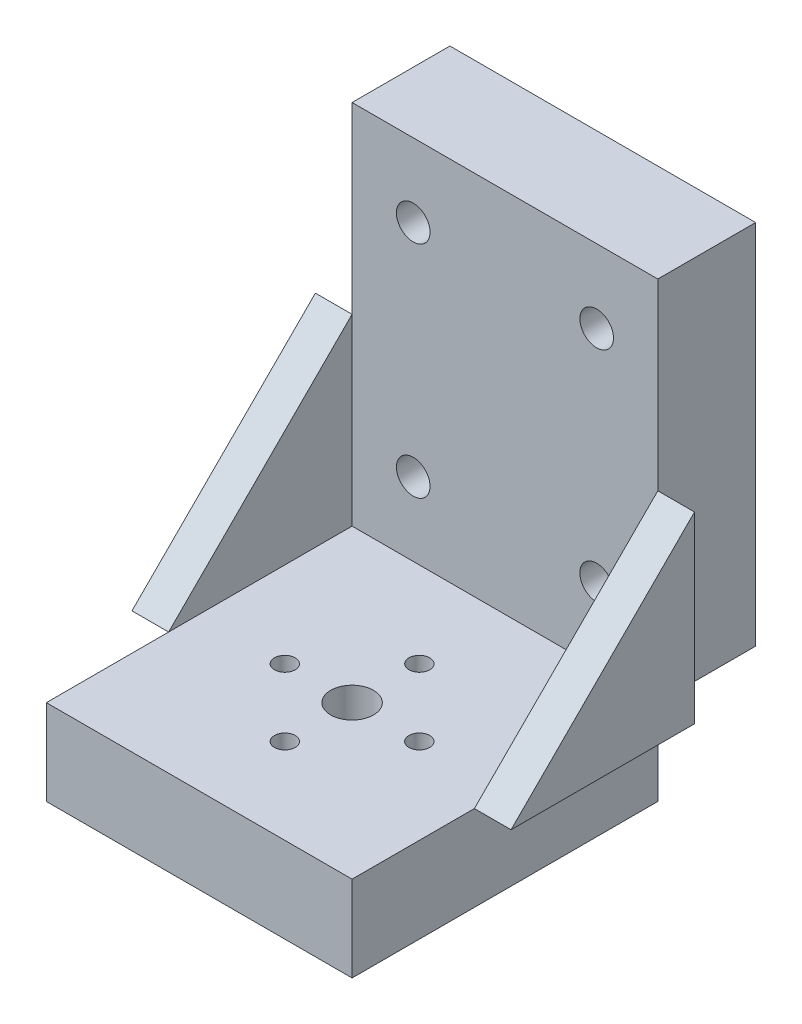
ISO-10303-21;
HEADER;
FILE_DESCRIPTION(('STEP AP214'),'2;1');
FILE_NAME('part.step','',(''),(''),'','','');
FILE_SCHEMA(('AUTOMOTIVE_DESIGN { 1 0 10303 214 1 1 1 1 }'));
ENDSEC;
DATA;
#1=APPLICATION_CONTEXT('core data for automotive mechanical design processes');
#2=APPLICATION_PROTOCOL_DEFINITION('international standard','automotive_design',2000,#1);
#3=PRODUCT_CONTEXT('',#1,'mechanical');
#4=PRODUCT('Part','Part','',(#3));
#5=PRODUCT_RELATED_PRODUCT_CATEGORY('part','',(#4));
#6=PRODUCT_DEFINITION_FORMATION('','',#4);
#7=PRODUCT_DEFINITION_CONTEXT('part definition',#1,'design');
#8=PRODUCT_DEFINITION('design','',#6,#7);
#9=PRODUCT_DEFINITION_SHAPE('','',#8);
#10=(LENGTH_UNIT() NAMED_UNIT(*) SI_UNIT(.MILLI.,.METRE.));
#11=(NAMED_UNIT(*) PLANE_ANGLE_UNIT() SI_UNIT($,.RADIAN.));
#12=(NAMED_UNIT(*) SI_UNIT($,.STERADIAN.) SOLID_ANGLE_UNIT());
#13=UNCERTAINTY_MEASURE_WITH_UNIT(LENGTH_MEASURE(1.E-05),#10,'distance_accuracy_value','');
#14=(GEOMETRIC_REPRESENTATION_CONTEXT(3) GLOBAL_UNCERTAINTY_ASSIGNED_CONTEXT((#13)) GLOBAL_UNIT_ASSIGNED_CONTEXT((#10,
#11,#12)) REPRESENTATION_CONTEXT('',''));
#15=CARTESIAN_POINT('',(0.,0.,0.));
#16=DIRECTION('',(0.,0.,1.));
#17=DIRECTION('',(1.,0.,0.));
#18=AXIS2_PLACEMENT_3D('',#15,#16,#17);
#19=CARTESIAN_POINT('',(31.,44.,-25.));
#20=DIRECTION('',(0.,0.,1.));
#21=DIRECTION('',(-1.,0.,0.));
#22=AXIS2_PLACEMENT_3D('',#19,#20,#21);
#23=PLANE('',#22);
#24=DIRECTION('',(0.,-1.,0.));
#25=VECTOR('',#24,1.);
#26=CARTESIAN_POINT('',(25.,44.,-25.));
#27=LINE('',#26,#25);
#28=CARTESIAN_POINT('',(25.,44.,-25.));
#29=VERTEX_POINT('',#28);
#30=CARTESIAN_POINT('',(25.,14.,-25.));
#31=VERTEX_POINT('',#30);
#32=EDGE_CURVE('E107',#29,#31,#27,.T.);
#33=ORIENTED_EDGE('',*,*,#32,.F.);
#34=DIRECTION('',(-1.,0.,0.));
#35=VECTOR('',#34,1.);
#36=CARTESIAN_POINT('',(31.,44.,-25.));
#37=LINE('',#36,#35);
#38=CARTESIAN_POINT('',(31.,44.,-25.));
#39=VERTEX_POINT('',#38);
#40=EDGE_CURVE('E103',#39,#29,#37,.T.);
#41=ORIENTED_EDGE('',*,*,#40,.F.);
#42=DIRECTION('',(0.,-1.,0.));
#43=VECTOR('',#42,1.);
#44=CARTESIAN_POINT('',(31.,44.,-25.));
#45=LINE('',#44,#43);
#46=CARTESIAN_POINT('',(31.,14.,-25.));
#47=VERTEX_POINT('',#46);
#48=EDGE_CURVE('E92',#39,#47,#45,.T.);
#49=ORIENTED_EDGE('',*,*,#48,.T.);
#50=DIRECTION('',(-1.,0.,0.));
#51=VECTOR('',#50,1.);
#52=CARTESIAN_POINT('',(31.,14.,-25.));
#53=LINE('',#52,#51);
#54=EDGE_CURVE('E12',#47,#31,#53,.T.);
#55=ORIENTED_EDGE('',*,*,#54,.T.);
#56=EDGE_LOOP('',(#33,#41,#49,#55));
#57=FACE_BOUND('',#56,.T.);
#58=ADVANCED_FACE('F57',(#57),#23,.F.);
#59=CARTESIAN_POINT('',(31.,14.,-25.));
#60=DIRECTION('',(0.,1.,0.));
#61=DIRECTION('',(0.,0.,1.));
#62=AXIS2_PLACEMENT_3D('',#59,#60,#61);
#63=PLANE('',#62);
#64=DIRECTION('',(0.,0.,1.));
#65=VECTOR('',#64,1.);
#66=CARTESIAN_POINT('',(25.,14.,-25.));
#67=LINE('',#66,#65);
#68=CARTESIAN_POINT('',(25.,14.,4.99999999999999));
#69=VERTEX_POINT('',#68);
#70=EDGE_CURVE('E99',#31,#69,#67,.T.);
#71=ORIENTED_EDGE('',*,*,#70,.F.);
#72=ORIENTED_EDGE('',*,*,#54,.F.);
#73=DIRECTION('',(0.,0.,1.));
#74=VECTOR('',#73,1.);
#75=CARTESIAN_POINT('',(31.,14.,-25.));
#76=LINE('',#75,#74);
#77=CARTESIAN_POINT('',(31.,14.,4.99999999999999));
#78=VERTEX_POINT('',#77);
#79=EDGE_CURVE('E93',#47,#78,#76,.T.);
#80=ORIENTED_EDGE('',*,*,#79,.T.);
#81=DIRECTION('',(-1.,0.,0.));
#82=VECTOR('',#81,1.);
#83=CARTESIAN_POINT('',(31.,14.,4.99999999999999));
#84=LINE('',#83,#82);
#85=EDGE_CURVE('E64',#78,#69,#84,.T.);
#86=ORIENTED_EDGE('',*,*,#85,.T.);
#87=EDGE_LOOP('',(#71,#72,#80,#86));
#88=FACE_BOUND('',#87,.T.);
#89=ADVANCED_FACE('F97',(#88),#63,.F.);
#90=CARTESIAN_POINT('',(31.,14.,4.99999999999999));
#91=DIRECTION('',(0.,-0.707106781186548,-0.707106781186548));
#92=DIRECTION('',(0.,0.707106781186548,-0.707106781186548));
#93=AXIS2_PLACEMENT_3D('',#90,#91,#92);
#94=PLANE('',#93);
#95=DIRECTION('',(0.,0.707106781186547,-0.707106781186547));
#96=VECTOR('',#95,1.);
#97=CARTESIAN_POINT('',(25.,14.,4.99999999999999));
#98=LINE('',#97,#96);
#99=EDGE_CURVE('E85',#69,#29,#98,.T.);
#100=ORIENTED_EDGE('',*,*,#99,.F.);
#101=ORIENTED_EDGE('',*,*,#85,.F.);
#102=DIRECTION('',(0.,0.707106781186547,-0.707106781186547));
#103=VECTOR('',#102,1.);
#104=CARTESIAN_POINT('',(31.,14.,4.99999999999999));
#105=LINE('',#104,#103);
#106=EDGE_CURVE('E75',#78,#39,#105,.T.);
#107=ORIENTED_EDGE('',*,*,#106,.T.);
#108=ORIENTED_EDGE('',*,*,#40,.T.);
#109=EDGE_LOOP('',(#100,#101,#107,#108));
#110=FACE_BOUND('',#109,.T.);
#111=ADVANCED_FACE('F120',(#110),#94,.F.);
#112=CARTESIAN_POINT('',(31.,0.,0.));
#113=DIRECTION('',(1.,0.,0.));
#114=DIRECTION('',(0.,0.,1.));
#115=AXIS2_PLACEMENT_3D('',#112,#113,#114);
#116=PLANE('',#115);
#117=ORIENTED_EDGE('',*,*,#48,.F.);
#118=ORIENTED_EDGE('',*,*,#106,.F.);
#119=ORIENTED_EDGE('',*,*,#79,.F.);
#120=EDGE_LOOP('',(#117,#118,#119));
#121=FACE_BOUND('',#120,.T.);
#122=ADVANCED_FACE('F91',(#121),#116,.T.);
#123=CARTESIAN_POINT('',(25.,0.,0.));
#124=DIRECTION('',(1.,0.,0.));
#125=DIRECTION('',(0.,0.,1.));
#126=AXIS2_PLACEMENT_3D('',#123,#124,#125);
#127=PLANE('',#126);
#128=ORIENTED_EDGE('',*,*,#32,.T.);
#129=ORIENTED_EDGE('',*,*,#70,.T.);
#130=ORIENTED_EDGE('',*,*,#99,.T.);
#131=EDGE_LOOP('',(#128,#129,#130));
#132=FACE_BOUND('',#131,.T.);
#133=ADVANCED_FACE('F112',(#132),#127,.F.);
#134=CLOSED_SHELL('',(#58,#89,#111,#122,#133));
#135=MANIFOLD_SOLID_BREP('B2',#134);
#136=CARTESIAN_POINT('',(-31.,44.,-25.));
#137=DIRECTION('',(0.,0.,1.));
#138=DIRECTION('',(1.,0.,0.));
#139=AXIS2_PLACEMENT_3D('',#136,#137,#138);
#140=PLANE('',#139);
#141=DIRECTION('',(0.,-1.,0.));
#142=VECTOR('',#141,1.);
#143=CARTESIAN_POINT('',(-25.,44.,-25.));
#144=LINE('',#143,#142);
#145=CARTESIAN_POINT('',(-25.,44.,-25.));
#146=VERTEX_POINT('',#145);
#147=CARTESIAN_POINT('',(-25.,14.,-25.));
#148=VERTEX_POINT('',#147);
#149=EDGE_CURVE('E211',#146,#148,#144,.T.);
#150=ORIENTED_EDGE('',*,*,#149,.T.);
#151=DIRECTION('',(1.,0.,0.));
#152=VECTOR('',#151,1.);
#153=CARTESIAN_POINT('',(-31.,14.,-25.));
#154=LINE('',#153,#152);
#155=CARTESIAN_POINT('',(-31.,14.,-25.));
#156=VERTEX_POINT('',#155);
#157=EDGE_CURVE('E53',#156,#148,#154,.T.);
#158=ORIENTED_EDGE('',*,*,#157,.F.);
#159=DIRECTION('',(0.,-1.,0.));
#160=VECTOR('',#159,1.);
#161=CARTESIAN_POINT('',(-31.,44.,-25.));
#162=LINE('',#161,#160);
#163=CARTESIAN_POINT('',(-31.,44.,-25.));
#164=VERTEX_POINT('',#163);
#165=EDGE_CURVE('E204',#164,#156,#162,.T.);
#166=ORIENTED_EDGE('',*,*,#165,.F.);
#167=DIRECTION('',(1.,0.,0.));
#168=VECTOR('',#167,1.);
#169=CARTESIAN_POINT('',(-31.,44.,-25.));
#170=LINE('',#169,#168);
#171=EDGE_CURVE('E215',#164,#146,#170,.T.);
#172=ORIENTED_EDGE('',*,*,#171,.T.);
#173=EDGE_LOOP('',(#150,#158,#166,#172));
#174=FACE_BOUND('',#173,.T.);
#175=ADVANCED_FACE('F163',(#174),#140,.F.);
#176=CARTESIAN_POINT('',(-31.,14.,-25.));
#177=DIRECTION('',(0.,1.,0.));
#178=DIRECTION('',(0.,0.,1.));
#179=AXIS2_PLACEMENT_3D('',#176,#177,#178);
#180=PLANE('',#179);
#181=DIRECTION('',(0.,0.,1.));
#182=VECTOR('',#181,1.);
#183=CARTESIAN_POINT('',(-25.,14.,-25.));
#184=LINE('',#183,#182);
#185=CARTESIAN_POINT('',(-25.,14.,4.99999999999999));
#186=VERTEX_POINT('',#185);
#187=EDGE_CURVE('E191',#148,#186,#184,.T.);
#188=ORIENTED_EDGE('',*,*,#187,.T.);
#189=DIRECTION('',(1.,0.,0.));
#190=VECTOR('',#189,1.);
#191=CARTESIAN_POINT('',(-31.,14.,4.99999999999999));
#192=LINE('',#191,#190);
#193=CARTESIAN_POINT('',(-31.,14.,4.99999999999999));
#194=VERTEX_POINT('',#193);
#195=EDGE_CURVE('E175',#194,#186,#192,.T.);
#196=ORIENTED_EDGE('',*,*,#195,.F.);
#197=DIRECTION('',(0.,0.,1.));
#198=VECTOR('',#197,1.);
#199=CARTESIAN_POINT('',(-31.,14.,-25.));
#200=LINE('',#199,#198);
#201=EDGE_CURVE('E199',#156,#194,#200,.T.);
#202=ORIENTED_EDGE('',*,*,#201,.F.);
#203=ORIENTED_EDGE('',*,*,#157,.T.);
#204=EDGE_LOOP('',(#188,#196,#202,#203));
#205=FACE_BOUND('',#204,.T.);
#206=ADVANCED_FACE('F203',(#205),#180,.F.);
#207=CARTESIAN_POINT('',(-31.,14.,4.99999999999999));
#208=DIRECTION('',(0.,-0.707106781186548,-0.707106781186548));
#209=DIRECTION('',(0.,0.707106781186548,-0.707106781186548));
#210=AXIS2_PLACEMENT_3D('',#207,#208,#209);
#211=PLANE('',#210);
#212=DIRECTION('',(0.,0.707106781186547,-0.707106781186547));
#213=VECTOR('',#212,1.);
#214=CARTESIAN_POINT('',(-25.,14.,4.99999999999999));
#215=LINE('',#214,#213);
#216=EDGE_CURVE('E197',#186,#146,#215,.T.);
#217=ORIENTED_EDGE('',*,*,#216,.T.);
#218=ORIENTED_EDGE('',*,*,#171,.F.);
#219=DIRECTION('',(0.,0.707106781186547,-0.707106781186547));
#220=VECTOR('',#219,1.);
#221=CARTESIAN_POINT('',(-31.,14.,4.99999999999999));
#222=LINE('',#221,#220);
#223=EDGE_CURVE('E176',#194,#164,#222,.T.);
#224=ORIENTED_EDGE('',*,*,#223,.F.);
#225=ORIENTED_EDGE('',*,*,#195,.T.);
#226=EDGE_LOOP('',(#217,#218,#224,#225));
#227=FACE_BOUND('',#226,.T.);
#228=ADVANCED_FACE('F218',(#227),#211,.F.);
#229=CARTESIAN_POINT('',(-31.,0.,0.));
#230=DIRECTION('',(-1.,0.,0.));
#231=DIRECTION('',(0.,0.,1.));
#232=AXIS2_PLACEMENT_3D('',#229,#230,#231);
#233=PLANE('',#232);
#234=ORIENTED_EDGE('',*,*,#165,.T.);
#235=ORIENTED_EDGE('',*,*,#201,.T.);
#236=ORIENTED_EDGE('',*,*,#223,.T.);
#237=EDGE_LOOP('',(#234,#235,#236));
#238=FACE_BOUND('',#237,.T.);
#239=ADVANCED_FACE('F210',(#238),#233,.T.);
#240=CARTESIAN_POINT('',(-25.,0.,0.));
#241=DIRECTION('',(-1.,0.,0.));
#242=DIRECTION('',(0.,0.,1.));
#243=AXIS2_PLACEMENT_3D('',#240,#241,#242);
#244=PLANE('',#243);
#245=ORIENTED_EDGE('',*,*,#149,.F.);
#246=ORIENTED_EDGE('',*,*,#216,.F.);
#247=ORIENTED_EDGE('',*,*,#187,.F.);
#248=EDGE_LOOP('',(#245,#246,#247));
#249=FACE_BOUND('',#248,.T.);
#250=ADVANCED_FACE('F219',(#249),#244,.F.);
#251=CLOSED_SHELL('',(#175,#206,#228,#239,#250));
#252=MANIFOLD_SOLID_BREP('B6',#251);
#253=CARTESIAN_POINT('',(-25.,14.,-25.));
#254=DIRECTION('',(0.,0.,1.));
#255=DIRECTION('',(1.,0.,0.));
#256=AXIS2_PLACEMENT_3D('',#253,#254,#255);
#257=PLANE('',#256);
#258=CARTESIAN_POINT('',(-15.,26.,-25.));
#259=DIRECTION('',(0.,0.,1.));
#260=DIRECTION('',(1.,0.,0.));
#261=AXIS2_PLACEMENT_3D('',#258,#259,#260);
#262=CIRCLE('',#261,2.75);
#263=CARTESIAN_POINT('',(-12.25,26.,-25.));
#264=VERTEX_POINT('',#263);
#265=EDGE_CURVE('E425',#264,#264,#262,.T.);
#266=ORIENTED_EDGE('',*,*,#265,.F.);
#267=EDGE_LOOP('',(#266));
#268=FACE_BOUND('',#267,.T.);
#269=CARTESIAN_POINT('',(15.,26.,-25.));
#270=DIRECTION('',(0.,0.,1.));
#271=DIRECTION('',(1.,0.,0.));
#272=AXIS2_PLACEMENT_3D('',#269,#270,#271);
#273=CIRCLE('',#272,2.75);
#274=CARTESIAN_POINT('',(17.75,26.,-25.));
#275=VERTEX_POINT('',#274);
#276=EDGE_CURVE('E411',#275,#275,#273,.T.);
#277=ORIENTED_EDGE('',*,*,#276,.F.);
#278=EDGE_LOOP('',(#277));
#279=FACE_BOUND('',#278,.T.);
#280=CARTESIAN_POINT('',(15.,62.,-25.));
#281=DIRECTION('',(0.,0.,1.));
#282=DIRECTION('',(1.,0.,0.));
#283=AXIS2_PLACEMENT_3D('',#280,#281,#282);
#284=CIRCLE('',#283,2.75);
#285=CARTESIAN_POINT('',(17.75,62.,-25.));
#286=VERTEX_POINT('',#285);
#287=EDGE_CURVE('E404',#286,#286,#284,.T.);
#288=ORIENTED_EDGE('',*,*,#287,.F.);
#289=EDGE_LOOP('',(#288));
#290=FACE_BOUND('',#289,.T.);
#291=CARTESIAN_POINT('',(-15.,62.,-25.));
#292=DIRECTION('',(0.,0.,1.));
#293=DIRECTION('',(1.,0.,0.));
#294=AXIS2_PLACEMENT_3D('',#291,#292,#293);
#295=CIRCLE('',#294,2.75);
#296=CARTESIAN_POINT('',(-12.25,62.,-25.));
#297=VERTEX_POINT('',#296);
#298=EDGE_CURVE('E410',#297,#297,#295,.T.);
#299=ORIENTED_EDGE('',*,*,#298,.F.);
#300=EDGE_LOOP('',(#299));
#301=FACE_BOUND('',#300,.T.);
#302=DIRECTION('',(0.,-1.,0.));
#303=VECTOR('',#302,1.);
#304=CARTESIAN_POINT('',(25.,14.,-25.));
#305=LINE('',#304,#303);
#306=CARTESIAN_POINT('',(25.,74.,-25.));
#307=VERTEX_POINT('',#306);
#308=CARTESIAN_POINT('',(25.,14.,-25.));
#309=VERTEX_POINT('',#308);
#310=EDGE_CURVE('E344',#307,#309,#305,.T.);
#311=ORIENTED_EDGE('',*,*,#310,.F.);
#312=DIRECTION('',(1.,0.,0.));
#313=VECTOR('',#312,1.);
#314=CARTESIAN_POINT('',(-25.,74.,-25.));
#315=LINE('',#314,#313);
#316=CARTESIAN_POINT('',(-25.,74.,-25.));
#317=VERTEX_POINT('',#316);
#318=EDGE_CURVE('E165',#317,#307,#315,.T.);
#319=ORIENTED_EDGE('',*,*,#318,.F.);
#320=DIRECTION('',(0.,-1.,0.));
#321=VECTOR('',#320,1.);
#322=CARTESIAN_POINT('',(-25.,14.,-25.));
#323=LINE('',#322,#321);
#324=CARTESIAN_POINT('',(-25.,14.,-25.));
#325=VERTEX_POINT('',#324);
#326=EDGE_CURVE('E313',#317,#325,#323,.T.);
#327=ORIENTED_EDGE('',*,*,#326,.T.);
#328=DIRECTION('',(1.,0.,0.));
#329=VECTOR('',#328,1.);
#330=CARTESIAN_POINT('',(-25.,14.,-25.));
#331=LINE('',#330,#329);
#332=EDGE_CURVE('E273',#325,#309,#331,.T.);
#333=ORIENTED_EDGE('',*,*,#332,.T.);
#334=EDGE_LOOP('',(#311,#319,#327,#333));
#335=FACE_BOUND('',#334,.T.);
#336=ADVANCED_FACE('F271',(#268,#279,#290,#301,#335),#257,.T.);
#337=CARTESIAN_POINT('',(-25.,74.,-25.));
#338=DIRECTION('',(0.,1.,0.));
#339=DIRECTION('',(0.,0.,1.));
#340=AXIS2_PLACEMENT_3D('',#337,#338,#339);
#341=PLANE('',#340);
#342=DIRECTION('',(0.,0.,1.));
#343=VECTOR('',#342,1.);
#344=CARTESIAN_POINT('',(25.,74.,-25.));
#345=LINE('',#344,#343);
#346=CARTESIAN_POINT('',(25.,74.,-41.));
#347=VERTEX_POINT('',#346);
#348=EDGE_CURVE('E338',#347,#307,#345,.T.);
#349=ORIENTED_EDGE('',*,*,#348,.F.);
#350=DIRECTION('',(1.,0.,0.));
#351=VECTOR('',#350,1.);
#352=CARTESIAN_POINT('',(-25.,74.,-41.));
#353=LINE('',#352,#351);
#354=CARTESIAN_POINT('',(-25.,74.,-41.));
#355=VERTEX_POINT('',#354);
#356=EDGE_CURVE('E283',#355,#347,#353,.T.);
#357=ORIENTED_EDGE('',*,*,#356,.F.);
#358=DIRECTION('',(0.,0.,1.));
#359=VECTOR('',#358,1.);
#360=CARTESIAN_POINT('',(-25.,74.,-25.));
#361=LINE('',#360,#359);
#362=EDGE_CURVE('E328',#355,#317,#361,.T.);
#363=ORIENTED_EDGE('',*,*,#362,.T.);
#364=ORIENTED_EDGE('',*,*,#318,.T.);
#365=EDGE_LOOP('',(#349,#357,#363,#364));
#366=FACE_BOUND('',#365,.T.);
#367=ADVANCED_FACE('F358',(#366),#341,.T.);
#368=CARTESIAN_POINT('',(-25.,14.,-41.));
#369=DIRECTION('',(0.,0.,-1.));
#370=DIRECTION('',(-1.,0.,0.));
#371=AXIS2_PLACEMENT_3D('',#368,#369,#370);
#372=PLANE('',#371);
#373=CARTESIAN_POINT('',(-15.,26.,-41.));
#374=DIRECTION('',(0.,0.,1.));
#375=DIRECTION('',(1.,0.,0.));
#376=AXIS2_PLACEMENT_3D('',#373,#374,#375);
#377=CIRCLE('',#376,2.75);
#378=CARTESIAN_POINT('',(-12.25,26.,-41.));
#379=VERTEX_POINT('',#378);
#380=EDGE_CURVE('E426',#379,#379,#377,.T.);
#381=ORIENTED_EDGE('',*,*,#380,.T.);
#382=EDGE_LOOP('',(#381));
#383=FACE_BOUND('',#382,.T.);
#384=CARTESIAN_POINT('',(15.,26.,-41.));
#385=DIRECTION('',(0.,0.,1.));
#386=DIRECTION('',(1.,0.,0.));
#387=AXIS2_PLACEMENT_3D('',#384,#385,#386);
#388=CIRCLE('',#387,2.75);
#389=CARTESIAN_POINT('',(17.75,26.,-41.));
#390=VERTEX_POINT('',#389);
#391=EDGE_CURVE('E416',#390,#390,#388,.T.);
#392=ORIENTED_EDGE('',*,*,#391,.T.);
#393=EDGE_LOOP('',(#392));
#394=FACE_BOUND('',#393,.T.);
#395=CARTESIAN_POINT('',(15.,62.,-41.));
#396=DIRECTION('',(0.,0.,1.));
#397=DIRECTION('',(1.,0.,0.));
#398=AXIS2_PLACEMENT_3D('',#395,#396,#397);
#399=CIRCLE('',#398,2.75);
#400=CARTESIAN_POINT('',(17.75,62.,-41.));
#401=VERTEX_POINT('',#400);
#402=EDGE_CURVE('E402',#401,#401,#399,.T.);
#403=ORIENTED_EDGE('',*,*,#402,.T.);
#404=EDGE_LOOP('',(#403));
#405=FACE_BOUND('',#404,.T.);
#406=CARTESIAN_POINT('',(-15.,62.,-41.));
#407=DIRECTION('',(0.,0.,1.));
#408=DIRECTION('',(1.,0.,0.));
#409=AXIS2_PLACEMENT_3D('',#406,#407,#408);
#410=CIRCLE('',#409,2.75);
#411=CARTESIAN_POINT('',(-12.25,62.,-41.));
#412=VERTEX_POINT('',#411);
#413=EDGE_CURVE('E350',#412,#412,#410,.T.);
#414=ORIENTED_EDGE('',*,*,#413,.T.);
#415=EDGE_LOOP('',(#414));
#416=FACE_BOUND('',#415,.T.);
#417=DIRECTION('',(0.,1.,0.));
#418=VECTOR('',#417,1.);
#419=CARTESIAN_POINT('',(25.,14.,-41.));
#420=LINE('',#419,#418);
#421=CARTESIAN_POINT('',(25.,14.,-41.));
#422=VERTEX_POINT('',#421);
#423=EDGE_CURVE('E317',#422,#347,#420,.T.);
#424=ORIENTED_EDGE('',*,*,#423,.F.);
#425=DIRECTION('',(1.,0.,0.));
#426=VECTOR('',#425,1.);
#427=CARTESIAN_POINT('',(-25.,14.,-41.));
#428=LINE('',#427,#426);
#429=CARTESIAN_POINT('',(-25.,14.,-41.));
#430=VERTEX_POINT('',#429);
#431=EDGE_CURVE('E314',#430,#422,#428,.T.);
#432=ORIENTED_EDGE('',*,*,#431,.F.);
#433=DIRECTION('',(0.,1.,0.));
#434=VECTOR('',#433,1.);
#435=CARTESIAN_POINT('',(-25.,14.,-41.));
#436=LINE('',#435,#434);
#437=EDGE_CURVE('E320',#430,#355,#436,.T.);
#438=ORIENTED_EDGE('',*,*,#437,.T.);
#439=ORIENTED_EDGE('',*,*,#356,.T.);
#440=EDGE_LOOP('',(#424,#432,#438,#439));
#441=FACE_BOUND('',#440,.T.);
#442=ADVANCED_FACE('F316',(#383,#394,#405,#416,#441),#372,.T.);
#443=CARTESIAN_POINT('',(-25.,14.,-25.));
#444=DIRECTION('',(0.,-1.,0.));
#445=DIRECTION('',(0.,0.,-1.));
#446=AXIS2_PLACEMENT_3D('',#443,#444,#445);
#447=PLANE('',#446);
#448=DIRECTION('',(0.,0.,-1.));
#449=VECTOR('',#448,1.);
#450=CARTESIAN_POINT('',(25.,14.,-25.));
#451=LINE('',#450,#449);
#452=EDGE_CURVE('E347',#309,#422,#451,.T.);
#453=ORIENTED_EDGE('',*,*,#452,.F.);
#454=ORIENTED_EDGE('',*,*,#332,.F.);
#455=DIRECTION('',(0.,0.,-1.));
#456=VECTOR('',#455,1.);
#457=CARTESIAN_POINT('',(-25.,14.,-25.));
#458=LINE('',#457,#456);
#459=EDGE_CURVE('E327',#325,#430,#458,.T.);
#460=ORIENTED_EDGE('',*,*,#459,.T.);
#461=ORIENTED_EDGE('',*,*,#431,.T.);
#462=EDGE_LOOP('',(#453,#454,#460,#461));
#463=FACE_BOUND('',#462,.T.);
#464=ADVANCED_FACE('F335',(#463),#447,.T.);
#465=CARTESIAN_POINT('',(-25.,0.,0.));
#466=DIRECTION('',(-1.,0.,0.));
#467=DIRECTION('',(0.,0.,1.));
#468=AXIS2_PLACEMENT_3D('',#465,#466,#467);
#469=PLANE('',#468);
#470=ORIENTED_EDGE('',*,*,#326,.F.);
#471=ORIENTED_EDGE('',*,*,#362,.F.);
#472=ORIENTED_EDGE('',*,*,#437,.F.);
#473=ORIENTED_EDGE('',*,*,#459,.F.);
#474=EDGE_LOOP('',(#470,#471,#472,#473));
#475=FACE_BOUND('',#474,.T.);
#476=ADVANCED_FACE('F330',(#475),#469,.T.);
#477=CARTESIAN_POINT('',(25.,0.,0.));
#478=DIRECTION('',(-1.,0.,0.));
#479=DIRECTION('',(0.,0.,1.));
#480=AXIS2_PLACEMENT_3D('',#477,#478,#479);
#481=PLANE('',#480);
#482=ORIENTED_EDGE('',*,*,#310,.T.);
#483=ORIENTED_EDGE('',*,*,#452,.T.);
#484=ORIENTED_EDGE('',*,*,#423,.T.);
#485=ORIENTED_EDGE('',*,*,#348,.T.);
#486=EDGE_LOOP('',(#482,#483,#484,#485));
#487=FACE_BOUND('',#486,.T.);
#488=ADVANCED_FACE('F360',(#487),#481,.F.);
#489=CARTESIAN_POINT('',(-15.,62.,-41.));
#490=DIRECTION('',(0.,0.,1.));
#491=DIRECTION('',(1.,0.,0.));
#492=AXIS2_PLACEMENT_3D('',#489,#490,#491);
#493=CYLINDRICAL_SURFACE('',#492,2.75);
#494=ORIENTED_EDGE('',*,*,#413,.F.);
#495=EDGE_LOOP('',(#494));
#496=FACE_BOUND('',#495,.T.);
#497=ORIENTED_EDGE('',*,*,#298,.T.);
#498=EDGE_LOOP('',(#497));
#499=FACE_BOUND('',#498,.T.);
#500=ADVANCED_FACE('F379',(#496,#499),#493,.F.);
#501=CARTESIAN_POINT('',(15.,62.,-41.));
#502=DIRECTION('',(0.,0.,1.));
#503=DIRECTION('',(1.,0.,0.));
#504=AXIS2_PLACEMENT_3D('',#501,#502,#503);
#505=CYLINDRICAL_SURFACE('',#504,2.75);
#506=ORIENTED_EDGE('',*,*,#402,.F.);
#507=EDGE_LOOP('',(#506));
#508=FACE_BOUND('',#507,.T.);
#509=ORIENTED_EDGE('',*,*,#287,.T.);
#510=EDGE_LOOP('',(#509));
#511=FACE_BOUND('',#510,.T.);
#512=ADVANCED_FACE('F383',(#508,#511),#505,.F.);
#513=CARTESIAN_POINT('',(15.,26.,-41.));
#514=DIRECTION('',(0.,0.,1.));
#515=DIRECTION('',(1.,0.,0.));
#516=AXIS2_PLACEMENT_3D('',#513,#514,#515);
#517=CYLINDRICAL_SURFACE('',#516,2.75);
#518=ORIENTED_EDGE('',*,*,#391,.F.);
#519=EDGE_LOOP('',(#518));
#520=FACE_BOUND('',#519,.T.);
#521=ORIENTED_EDGE('',*,*,#276,.T.);
#522=EDGE_LOOP('',(#521));
#523=FACE_BOUND('',#522,.T.);
#524=ADVANCED_FACE('F386',(#520,#523),#517,.F.);
#525=CARTESIAN_POINT('',(-15.,26.,-41.));
#526=DIRECTION('',(0.,0.,1.));
#527=DIRECTION('',(1.,0.,0.));
#528=AXIS2_PLACEMENT_3D('',#525,#526,#527);
#529=CYLINDRICAL_SURFACE('',#528,2.75);
#530=ORIENTED_EDGE('',*,*,#380,.F.);
#531=EDGE_LOOP('',(#530));
#532=FACE_BOUND('',#531,.T.);
#533=ORIENTED_EDGE('',*,*,#265,.T.);
#534=EDGE_LOOP('',(#533));
#535=FACE_BOUND('',#534,.T.);
#536=ADVANCED_FACE('F387',(#532,#535),#529,.F.);
#537=CLOSED_SHELL('',(#336,#367,#442,#464,#476,#488,#500,#512,#524,#536));
#538=MANIFOLD_SOLID_BREP('B48',#537);
#539=CARTESIAN_POINT('',(0.,14.,0.));
#540=DIRECTION('',(0.,-1.,0.));
#541=DIRECTION('',(0.,0.,-1.));
#542=AXIS2_PLACEMENT_3D('',#539,#540,#541);
#543=PLANE('',#542);
#544=CARTESIAN_POINT('',(0.,14.,-11.));
#545=DIRECTION('',(0.,1.,0.));
#546=DIRECTION('',(0.,0.,1.));
#547=AXIS2_PLACEMENT_3D('',#544,#545,#546);
#548=CIRCLE('',#547,1.7);
#549=CARTESIAN_POINT('',(0.,14.,-9.3));
#550=VERTEX_POINT('',#549);
#551=EDGE_CURVE('E598',#550,#550,#548,.T.);
#552=ORIENTED_EDGE('',*,*,#551,.F.);
#553=EDGE_LOOP('',(#552));
#554=FACE_BOUND('',#553,.T.);
#555=CARTESIAN_POINT('',(11.,14.,0.));
#556=DIRECTION('',(0.,1.,0.));
#557=DIRECTION('',(0.,0.,1.));
#558=AXIS2_PLACEMENT_3D('',#555,#556,#557);
#559=CIRCLE('',#558,1.7);
#560=CARTESIAN_POINT('',(11.,14.,1.7));
#561=VERTEX_POINT('',#560);
#562=EDGE_CURVE('E594',#561,#561,#559,.T.);
#563=ORIENTED_EDGE('',*,*,#562,.F.);
#564=EDGE_LOOP('',(#563));
#565=FACE_BOUND('',#564,.T.);
#566=CARTESIAN_POINT('',(0.,14.,11.));
#567=DIRECTION('',(0.,1.,0.));
#568=DIRECTION('',(0.,0.,1.));
#569=AXIS2_PLACEMENT_3D('',#566,#567,#568);
#570=CIRCLE('',#569,1.7);
#571=CARTESIAN_POINT('',(0.,14.,12.7));
#572=VERTEX_POINT('',#571);
#573=EDGE_CURVE('E589',#572,#572,#570,.T.);
#574=ORIENTED_EDGE('',*,*,#573,.F.);
#575=EDGE_LOOP('',(#574));
#576=FACE_BOUND('',#575,.T.);
#577=CARTESIAN_POINT('',(-11.,14.,0.));
#578=DIRECTION('',(0.,1.,0.));
#579=DIRECTION('',(0.,0.,1.));
#580=AXIS2_PLACEMENT_3D('',#577,#578,#579);
#581=CIRCLE('',#580,1.7);
#582=CARTESIAN_POINT('',(-11.,14.,1.7));
#583=VERTEX_POINT('',#582);
#584=EDGE_CURVE('E581',#583,#583,#581,.T.);
#585=ORIENTED_EDGE('',*,*,#584,.F.);
#586=EDGE_LOOP('',(#585));
#587=FACE_BOUND('',#586,.T.);
#588=DIRECTION('',(0.,0.,-1.));
#589=VECTOR('',#588,1.);
#590=CARTESIAN_POINT('',(25.,14.,25.));
#591=LINE('',#590,#589);
#592=CARTESIAN_POINT('',(25.,14.,25.));
#593=VERTEX_POINT('',#592);
#594=CARTESIAN_POINT('',(25.,14.,-25.));
#595=VERTEX_POINT('',#594);
#596=EDGE_CURVE('E550',#593,#595,#591,.T.);
#597=ORIENTED_EDGE('',*,*,#596,.T.);
#598=DIRECTION('',(-1.,0.,0.));
#599=VECTOR('',#598,1.);
#600=CARTESIAN_POINT('',(-25.,14.,-25.));
#601=LINE('',#600,#599);
#602=CARTESIAN_POINT('',(-25.,14.,-25.));
#603=VERTEX_POINT('',#602);
#604=EDGE_CURVE('E545',#595,#603,#601,.T.);
#605=ORIENTED_EDGE('',*,*,#604,.T.);
#606=DIRECTION('',(0.,0.,1.));
#607=VECTOR('',#606,1.);
#608=CARTESIAN_POINT('',(-25.,14.,25.));
#609=LINE('',#608,#607);
#610=CARTESIAN_POINT('',(-25.,14.,25.));
#611=VERTEX_POINT('',#610);
#612=EDGE_CURVE('E544',#603,#611,#609,.T.);
#613=ORIENTED_EDGE('',*,*,#612,.T.);
#614=DIRECTION('',(1.,0.,0.));
#615=VECTOR('',#614,1.);
#616=CARTESIAN_POINT('',(-25.,14.,25.));
#617=LINE('',#616,#615);
#618=EDGE_CURVE('E515',#611,#593,#617,.T.);
#619=ORIENTED_EDGE('',*,*,#618,.T.);
#620=EDGE_LOOP('',(#597,#605,#613,#619));
#621=FACE_BOUND('',#620,.T.);
#622=CARTESIAN_POINT('',(0.,14.,0.));
#623=DIRECTION('',(0.,1.,0.));
#624=DIRECTION('',(0.,0.,1.));
#625=AXIS2_PLACEMENT_3D('',#622,#623,#624);
#626=CIRCLE('',#625,3.5);
#627=CARTESIAN_POINT('',(0.,14.,3.49999999999999));
#628=VERTEX_POINT('',#627);
#629=EDGE_CURVE('E564',#628,#628,#626,.T.);
#630=ORIENTED_EDGE('',*,*,#629,.F.);
#631=EDGE_LOOP('',(#630));
#632=FACE_BOUND('',#631,.T.);
#633=ADVANCED_FACE('F494',(#554,#565,#576,#587,#621,#632),#543,.F.);
#634=CARTESIAN_POINT('',(0.,0.,0.));
#635=DIRECTION('',(0.,-1.,0.));
#636=DIRECTION('',(0.,0.,-1.));
#637=AXIS2_PLACEMENT_3D('',#634,#635,#636);
#638=PLANE('',#637);
#639=CARTESIAN_POINT('',(0.,0.,-11.));
#640=DIRECTION('',(0.,1.,0.));
#641=DIRECTION('',(0.,0.,1.));
#642=AXIS2_PLACEMENT_3D('',#639,#640,#641);
#643=CIRCLE('',#642,1.7);
#644=CARTESIAN_POINT('',(0.,0.,-9.3));
#645=VERTEX_POINT('',#644);
#646=EDGE_CURVE('E576',#645,#645,#643,.T.);
#647=ORIENTED_EDGE('',*,*,#646,.T.);
#648=EDGE_LOOP('',(#647));
#649=FACE_BOUND('',#648,.T.);
#650=CARTESIAN_POINT('',(11.,0.,0.));
#651=DIRECTION('',(0.,1.,0.));
#652=DIRECTION('',(0.,0.,1.));
#653=AXIS2_PLACEMENT_3D('',#650,#651,#652);
#654=CIRCLE('',#653,1.7);
#655=CARTESIAN_POINT('',(11.,0.,1.7));
#656=VERTEX_POINT('',#655);
#657=EDGE_CURVE('E595',#656,#656,#654,.T.);
#658=ORIENTED_EDGE('',*,*,#657,.T.);
#659=EDGE_LOOP('',(#658));
#660=FACE_BOUND('',#659,.T.);
#661=CARTESIAN_POINT('',(0.,0.,11.));
#662=DIRECTION('',(0.,1.,0.));
#663=DIRECTION('',(0.,0.,1.));
#664=AXIS2_PLACEMENT_3D('',#661,#662,#663);
#665=CIRCLE('',#664,1.7);
#666=CARTESIAN_POINT('',(0.,0.,12.7));
#667=VERTEX_POINT('',#666);
#668=EDGE_CURVE('E588',#667,#667,#665,.T.);
#669=ORIENTED_EDGE('',*,*,#668,.T.);
#670=EDGE_LOOP('',(#669));
#671=FACE_BOUND('',#670,.T.);
#672=CARTESIAN_POINT('',(-11.,0.,0.));
#673=DIRECTION('',(0.,1.,0.));
#674=DIRECTION('',(0.,0.,1.));
#675=AXIS2_PLACEMENT_3D('',#672,#673,#674);
#676=CIRCLE('',#675,1.7);
#677=CARTESIAN_POINT('',(-11.,0.,1.7));
#678=VERTEX_POINT('',#677);
#679=EDGE_CURVE('E577',#678,#678,#676,.T.);
#680=ORIENTED_EDGE('',*,*,#679,.T.);
#681=EDGE_LOOP('',(#680));
#682=FACE_BOUND('',#681,.T.);
#683=DIRECTION('',(0.,0.,-1.));
#684=VECTOR('',#683,1.);
#685=CARTESIAN_POINT('',(25.,0.,25.));
#686=LINE('',#685,#684);
#687=CARTESIAN_POINT('',(25.,0.,25.));
#688=VERTEX_POINT('',#687);
#689=CARTESIAN_POINT('',(25.,0.,-25.));
#690=VERTEX_POINT('',#689);
#691=EDGE_CURVE('E559',#688,#690,#686,.T.);
#692=ORIENTED_EDGE('',*,*,#691,.F.);
#693=DIRECTION('',(1.,0.,0.));
#694=VECTOR('',#693,1.);
#695=CARTESIAN_POINT('',(-25.,0.,25.));
#696=LINE('',#695,#694);
#697=CARTESIAN_POINT('',(-25.,0.,25.));
#698=VERTEX_POINT('',#697);
#699=EDGE_CURVE('E532',#698,#688,#696,.T.);
#700=ORIENTED_EDGE('',*,*,#699,.F.);
#701=DIRECTION('',(0.,0.,1.));
#702=VECTOR('',#701,1.);
#703=CARTESIAN_POINT('',(-25.,0.,25.));
#704=LINE('',#703,#702);
#705=CARTESIAN_POINT('',(-25.,0.,-25.));
#706=VERTEX_POINT('',#705);
#707=EDGE_CURVE('E530',#706,#698,#704,.T.);
#708=ORIENTED_EDGE('',*,*,#707,.F.);
#709=DIRECTION('',(-1.,0.,0.));
#710=VECTOR('',#709,1.);
#711=CARTESIAN_POINT('',(-25.,0.,-25.));
#712=LINE('',#711,#710);
#713=EDGE_CURVE('E552',#690,#706,#712,.T.);
#714=ORIENTED_EDGE('',*,*,#713,.F.);
#715=EDGE_LOOP('',(#692,#700,#708,#714));
#716=FACE_BOUND('',#715,.T.);
#717=CARTESIAN_POINT('',(0.,0.,0.));
#718=DIRECTION('',(0.,1.,0.));
#719=DIRECTION('',(0.,0.,1.));
#720=AXIS2_PLACEMENT_3D('',#717,#718,#719);
#721=CIRCLE('',#720,3.5);
#722=CARTESIAN_POINT('',(0.,0.,3.49999999999999));
#723=VERTEX_POINT('',#722);
#724=EDGE_CURVE('E574',#723,#723,#721,.T.);
#725=ORIENTED_EDGE('',*,*,#724,.T.);
#726=EDGE_LOOP('',(#725));
#727=FACE_BOUND('',#726,.T.);
#728=ADVANCED_FACE('F568',(#649,#660,#671,#682,#716,#727),#638,.T.);
#729=CARTESIAN_POINT('',(25.,14.,25.));
#730=DIRECTION('',(-1.,0.,0.));
#731=DIRECTION('',(0.,0.,1.));
#732=AXIS2_PLACEMENT_3D('',#729,#730,#731);
#733=PLANE('',#732);
#734=ORIENTED_EDGE('',*,*,#691,.T.);
#735=DIRECTION('',(0.,-1.,0.));
#736=VECTOR('',#735,1.);
#737=CARTESIAN_POINT('',(25.,14.,-25.));
#738=LINE('',#737,#736);
#739=EDGE_CURVE('E267',#595,#690,#738,.T.);
#740=ORIENTED_EDGE('',*,*,#739,.F.);
#741=ORIENTED_EDGE('',*,*,#596,.F.);
#742=DIRECTION('',(0.,-1.,0.));
#743=VECTOR('',#742,1.);
#744=CARTESIAN_POINT('',(25.,14.,25.));
#745=LINE('',#744,#743);
#746=EDGE_CURVE('E553',#593,#688,#745,.T.);
#747=ORIENTED_EDGE('',*,*,#746,.T.);
#748=EDGE_LOOP('',(#734,#740,#741,#747));
#749=FACE_BOUND('',#748,.T.);
#750=ADVANCED_FACE('F500',(#749),#733,.F.);
#751=CARTESIAN_POINT('',(-25.,14.,-25.));
#752=DIRECTION('',(0.,0.,1.));
#753=DIRECTION('',(1.,0.,0.));
#754=AXIS2_PLACEMENT_3D('',#751,#752,#753);
#755=PLANE('',#754);
#756=ORIENTED_EDGE('',*,*,#713,.T.);
#757=DIRECTION('',(0.,-1.,0.));
#758=VECTOR('',#757,1.);
#759=CARTESIAN_POINT('',(-25.,14.,-25.));
#760=LINE('',#759,#758);
#761=EDGE_CURVE('E504',#603,#706,#760,.T.);
#762=ORIENTED_EDGE('',*,*,#761,.F.);
#763=ORIENTED_EDGE('',*,*,#604,.F.);
#764=ORIENTED_EDGE('',*,*,#739,.T.);
#765=EDGE_LOOP('',(#756,#762,#763,#764));
#766=FACE_BOUND('',#765,.T.);
#767=ADVANCED_FACE('F549',(#766),#755,.F.);
#768=CARTESIAN_POINT('',(-25.,14.,25.));
#769=DIRECTION('',(1.,0.,0.));
#770=DIRECTION('',(0.,0.,-1.));
#771=AXIS2_PLACEMENT_3D('',#768,#769,#770);
#772=PLANE('',#771);
#773=ORIENTED_EDGE('',*,*,#707,.T.);
#774=DIRECTION('',(0.,-1.,0.));
#775=VECTOR('',#774,1.);
#776=CARTESIAN_POINT('',(-25.,14.,25.));
#777=LINE('',#776,#775);
#778=EDGE_CURVE('E555',#611,#698,#777,.T.);
#779=ORIENTED_EDGE('',*,*,#778,.F.);
#780=ORIENTED_EDGE('',*,*,#612,.F.);
#781=ORIENTED_EDGE('',*,*,#761,.T.);
#782=EDGE_LOOP('',(#773,#779,#780,#781));
#783=FACE_BOUND('',#782,.T.);
#784=ADVANCED_FACE('F554',(#783),#772,.F.);
#785=CARTESIAN_POINT('',(-25.,14.,25.));
#786=DIRECTION('',(0.,0.,-1.));
#787=DIRECTION('',(-1.,0.,0.));
#788=AXIS2_PLACEMENT_3D('',#785,#786,#787);
#789=PLANE('',#788);
#790=ORIENTED_EDGE('',*,*,#699,.T.);
#791=ORIENTED_EDGE('',*,*,#746,.F.);
#792=ORIENTED_EDGE('',*,*,#618,.F.);
#793=ORIENTED_EDGE('',*,*,#778,.T.);
#794=EDGE_LOOP('',(#790,#791,#792,#793));
#795=FACE_BOUND('',#794,.T.);
#796=ADVANCED_FACE('F570',(#795),#789,.F.);
#797=CARTESIAN_POINT('',(0.,14.,0.));
#798=DIRECTION('',(0.,-1.,0.));
#799=DIRECTION('',(0.,0.,-1.));
#800=AXIS2_PLACEMENT_3D('',#797,#798,#799);
#801=CYLINDRICAL_SURFACE('',#800,3.5);
#802=ORIENTED_EDGE('',*,*,#629,.T.);
#803=EDGE_LOOP('',(#802));
#804=FACE_BOUND('',#803,.T.);
#805=ORIENTED_EDGE('',*,*,#724,.F.);
#806=EDGE_LOOP('',(#805));
#807=FACE_BOUND('',#806,.T.);
#808=ADVANCED_FACE('F623',(#804,#807),#801,.F.);
#809=CARTESIAN_POINT('',(-11.,0.,0.));
#810=DIRECTION('',(0.,1.,0.));
#811=DIRECTION('',(0.,0.,1.));
#812=AXIS2_PLACEMENT_3D('',#809,#810,#811);
#813=CYLINDRICAL_SURFACE('',#812,1.7);
#814=ORIENTED_EDGE('',*,*,#679,.F.);
#815=EDGE_LOOP('',(#814));
#816=FACE_BOUND('',#815,.T.);
#817=ORIENTED_EDGE('',*,*,#584,.T.);
#818=EDGE_LOOP('',(#817));
#819=FACE_BOUND('',#818,.T.);
#820=ADVANCED_FACE('F625',(#816,#819),#813,.F.);
#821=CARTESIAN_POINT('',(0.,0.,11.));
#822=DIRECTION('',(0.,1.,0.));
#823=DIRECTION('',(0.,0.,1.));
#824=AXIS2_PLACEMENT_3D('',#821,#822,#823);
#825=CYLINDRICAL_SURFACE('',#824,1.7);
#826=ORIENTED_EDGE('',*,*,#668,.F.);
#827=EDGE_LOOP('',(#826));
#828=FACE_BOUND('',#827,.T.);
#829=ORIENTED_EDGE('',*,*,#573,.T.);
#830=EDGE_LOOP('',(#829));
#831=FACE_BOUND('',#830,.T.);
#832=ADVANCED_FACE('F624',(#828,#831),#825,.F.);
#833=CARTESIAN_POINT('',(11.,0.,0.));
#834=DIRECTION('',(0.,1.,0.));
#835=DIRECTION('',(0.,0.,1.));
#836=AXIS2_PLACEMENT_3D('',#833,#834,#835);
#837=CYLINDRICAL_SURFACE('',#836,1.7);
#838=ORIENTED_EDGE('',*,*,#657,.F.);
#839=EDGE_LOOP('',(#838));
#840=FACE_BOUND('',#839,.T.);
#841=ORIENTED_EDGE('',*,*,#562,.T.);
#842=EDGE_LOOP('',(#841));
#843=FACE_BOUND('',#842,.T.);
#844=ADVANCED_FACE('F606',(#840,#843),#837,.F.);
#845=CARTESIAN_POINT('',(0.,0.,-11.));
#846=DIRECTION('',(0.,1.,0.));
#847=DIRECTION('',(0.,0.,1.));
#848=AXIS2_PLACEMENT_3D('',#845,#846,#847);
#849=CYLINDRICAL_SURFACE('',#848,1.7);
#850=ORIENTED_EDGE('',*,*,#646,.F.);
#851=EDGE_LOOP('',(#850));
#852=FACE_BOUND('',#851,.T.);
#853=ORIENTED_EDGE('',*,*,#551,.T.);
#854=EDGE_LOOP('',(#853));
#855=FACE_BOUND('',#854,.T.);
#856=ADVANCED_FACE('F607',(#852,#855),#849,.F.);
#857=CLOSED_SHELL('',(#633,#728,#750,#767,#784,#796,#808,#820,#832,#844,#856));
#858=MANIFOLD_SOLID_BREP('B156',#857);
#859=ADVANCED_BREP_SHAPE_REPRESENTATION('',(#18,#135,#252,#538,#858),#14);
#860=SHAPE_DEFINITION_REPRESENTATION(#9,#859);
ENDSEC;
END-ISO-10303-21;
